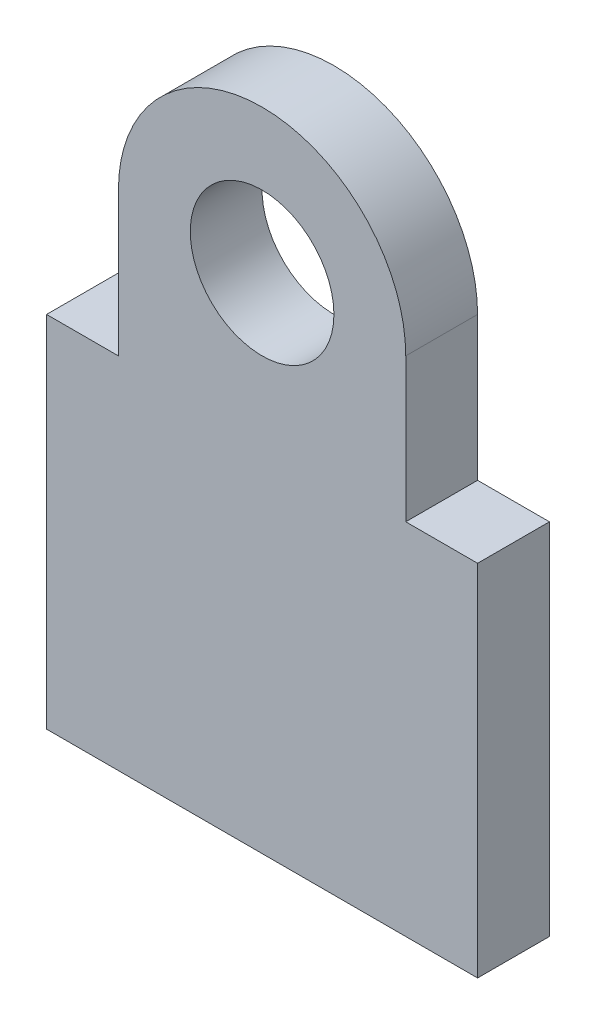
ISO-10303-21;
HEADER;
FILE_DESCRIPTION(('STEP AP214'),'2;1');
FILE_NAME('part.step','',(''),(''),'','','');
FILE_SCHEMA(('AUTOMOTIVE_DESIGN { 1 0 10303 214 1 1 1 1 }'));
ENDSEC;
DATA;
#1=APPLICATION_CONTEXT('core data for automotive mechanical design processes');
#2=APPLICATION_PROTOCOL_DEFINITION('international standard','automotive_design',2000,#1);
#3=PRODUCT_CONTEXT('',#1,'mechanical');
#4=PRODUCT('Part','Part','',(#3));
#5=PRODUCT_RELATED_PRODUCT_CATEGORY('part','',(#4));
#6=PRODUCT_DEFINITION_FORMATION('','',#4);
#7=PRODUCT_DEFINITION_CONTEXT('part definition',#1,'design');
#8=PRODUCT_DEFINITION('design','',#6,#7);
#9=PRODUCT_DEFINITION_SHAPE('','',#8);
#10=(LENGTH_UNIT() NAMED_UNIT(*) SI_UNIT(.MILLI.,.METRE.));
#11=(NAMED_UNIT(*) PLANE_ANGLE_UNIT() SI_UNIT($,.RADIAN.));
#12=(NAMED_UNIT(*) SI_UNIT($,.STERADIAN.) SOLID_ANGLE_UNIT());
#13=UNCERTAINTY_MEASURE_WITH_UNIT(LENGTH_MEASURE(1.E-05),#10,'distance_accuracy_value','');
#14=(GEOMETRIC_REPRESENTATION_CONTEXT(3) GLOBAL_UNCERTAINTY_ASSIGNED_CONTEXT((#13)) GLOBAL_UNIT_ASSIGNED_CONTEXT((#10,
#11,#12)) REPRESENTATION_CONTEXT('',''));
#15=CARTESIAN_POINT('',(0.,0.,0.));
#16=DIRECTION('',(0.,0.,1.));
#17=DIRECTION('',(1.,0.,0.));
#18=AXIS2_PLACEMENT_3D('',#15,#16,#17);
#19=CARTESIAN_POINT('',(30.,0.,10.));
#20=DIRECTION('',(-1.,0.,0.));
#21=DIRECTION('',(0.,0.,1.));
#22=AXIS2_PLACEMENT_3D('',#19,#20,#21);
#23=PLANE('',#22);
#24=DIRECTION('',(0.,1.,0.));
#25=VECTOR('',#24,1.);
#26=CARTESIAN_POINT('',(30.,0.,0.));
#27=LINE('',#26,#25);
#28=CARTESIAN_POINT('',(30.,-30.,0.));
#29=VERTEX_POINT('',#28);
#30=CARTESIAN_POINT('',(30.,20.,0.));
#31=VERTEX_POINT('',#30);
#32=EDGE_CURVE('E123',#29,#31,#27,.T.);
#33=ORIENTED_EDGE('',*,*,#32,.T.);
#34=DIRECTION('',(0.,0.,-1.));
#35=VECTOR('',#34,1.);
#36=CARTESIAN_POINT('',(30.,20.,10.));
#37=LINE('',#36,#35);
#38=CARTESIAN_POINT('',(30.,20.,10.));
#39=VERTEX_POINT('',#38);
#40=EDGE_CURVE('E11',#39,#31,#37,.T.);
#41=ORIENTED_EDGE('',*,*,#40,.F.);
#42=DIRECTION('',(0.,1.,0.));
#43=VECTOR('',#42,1.);
#44=CARTESIAN_POINT('',(30.,0.,10.));
#45=LINE('',#44,#43);
#46=CARTESIAN_POINT('',(30.,-30.,10.));
#47=VERTEX_POINT('',#46);
#48=EDGE_CURVE('E137',#47,#39,#45,.T.);
#49=ORIENTED_EDGE('',*,*,#48,.F.);
#50=DIRECTION('',(0.,0.,1.));
#51=VECTOR('',#50,1.);
#52=CARTESIAN_POINT('',(30.,-30.,0.));
#53=LINE('',#52,#51);
#54=EDGE_CURVE('E127',#29,#47,#53,.T.);
#55=ORIENTED_EDGE('',*,*,#54,.F.);
#56=EDGE_LOOP('',(#33,#41,#49,#55));
#57=FACE_BOUND('',#56,.T.);
#58=ADVANCED_FACE('F32',(#57),#23,.F.);
#59=CARTESIAN_POINT('',(30.,20.,10.));
#60=DIRECTION('',(0.,-1.,0.));
#61=DIRECTION('',(1.,0.,0.));
#62=AXIS2_PLACEMENT_3D('',#59,#60,#61);
#63=PLANE('',#62);
#64=DIRECTION('',(-1.,0.,0.));
#65=VECTOR('',#64,1.);
#66=CARTESIAN_POINT('',(30.,20.,0.));
#67=LINE('',#66,#65);
#68=CARTESIAN_POINT('',(20.,20.,0.));
#69=VERTEX_POINT('',#68);
#70=EDGE_CURVE('E126',#31,#69,#67,.T.);
#71=ORIENTED_EDGE('',*,*,#70,.T.);
#72=DIRECTION('',(0.,0.,-1.));
#73=VECTOR('',#72,1.);
#74=CARTESIAN_POINT('',(20.,20.,10.));
#75=LINE('',#74,#73);
#76=CARTESIAN_POINT('',(20.,20.,10.));
#77=VERTEX_POINT('',#76);
#78=EDGE_CURVE('E40',#77,#69,#75,.T.);
#79=ORIENTED_EDGE('',*,*,#78,.F.);
#80=DIRECTION('',(-1.,0.,0.));
#81=VECTOR('',#80,1.);
#82=CARTESIAN_POINT('',(30.,20.,10.));
#83=LINE('',#82,#81);
#84=EDGE_CURVE('E86',#39,#77,#83,.T.);
#85=ORIENTED_EDGE('',*,*,#84,.F.);
#86=ORIENTED_EDGE('',*,*,#40,.T.);
#87=EDGE_LOOP('',(#71,#79,#85,#86));
#88=FACE_BOUND('',#87,.T.);
#89=ADVANCED_FACE('F176',(#88),#63,.F.);
#90=CARTESIAN_POINT('',(20.,20.,10.));
#91=DIRECTION('',(-1.,0.,0.));
#92=DIRECTION('',(0.,0.,1.));
#93=AXIS2_PLACEMENT_3D('',#90,#91,#92);
#94=PLANE('',#93);
#95=DIRECTION('',(0.,1.,0.));
#96=VECTOR('',#95,1.);
#97=CARTESIAN_POINT('',(20.,20.,0.));
#98=LINE('',#97,#96);
#99=CARTESIAN_POINT('',(20.,40.,0.));
#100=VERTEX_POINT('',#99);
#101=EDGE_CURVE('E129',#69,#100,#98,.T.);
#102=ORIENTED_EDGE('',*,*,#101,.T.);
#103=DIRECTION('',(0.,0.,-1.));
#104=VECTOR('',#103,1.);
#105=CARTESIAN_POINT('',(20.,40.,10.));
#106=LINE('',#105,#104);
#107=CARTESIAN_POINT('',(20.,40.,10.));
#108=VERTEX_POINT('',#107);
#109=EDGE_CURVE('E112',#108,#100,#106,.T.);
#110=ORIENTED_EDGE('',*,*,#109,.F.);
#111=DIRECTION('',(0.,1.,0.));
#112=VECTOR('',#111,1.);
#113=CARTESIAN_POINT('',(20.,20.,10.));
#114=LINE('',#113,#112);
#115=EDGE_CURVE('E103',#77,#108,#114,.T.);
#116=ORIENTED_EDGE('',*,*,#115,.F.);
#117=ORIENTED_EDGE('',*,*,#78,.T.);
#118=EDGE_LOOP('',(#102,#110,#116,#117));
#119=FACE_BOUND('',#118,.T.);
#120=ADVANCED_FACE('F143',(#119),#94,.F.);
#121=CARTESIAN_POINT('',(0.,40.,10.));
#122=DIRECTION('',(0.,0.,-1.));
#123=DIRECTION('',(-1.,0.,0.));
#124=AXIS2_PLACEMENT_3D('',#121,#122,#123);
#125=CYLINDRICAL_SURFACE('',#124,20.);
#126=CARTESIAN_POINT('',(0.,40.,0.));
#127=DIRECTION('',(0.,0.,1.));
#128=DIRECTION('',(1.,0.,0.));
#129=AXIS2_PLACEMENT_3D('',#126,#127,#128);
#130=CIRCLE('',#129,20.);
#131=CARTESIAN_POINT('',(-20.,40.,0.));
#132=VERTEX_POINT('',#131);
#133=EDGE_CURVE('E111',#100,#132,#130,.T.);
#134=ORIENTED_EDGE('',*,*,#133,.T.);
#135=DIRECTION('',(0.,0.,-1.));
#136=VECTOR('',#135,1.);
#137=CARTESIAN_POINT('',(-20.,40.,10.));
#138=LINE('',#137,#136);
#139=CARTESIAN_POINT('',(-20.,40.,10.));
#140=VERTEX_POINT('',#139);
#141=EDGE_CURVE('E108',#140,#132,#138,.T.);
#142=ORIENTED_EDGE('',*,*,#141,.F.);
#143=CARTESIAN_POINT('',(0.,40.,10.));
#144=DIRECTION('',(0.,0.,1.));
#145=DIRECTION('',(1.,0.,0.));
#146=AXIS2_PLACEMENT_3D('',#143,#144,#145);
#147=CIRCLE('',#146,20.);
#148=EDGE_CURVE('E97',#108,#140,#147,.T.);
#149=ORIENTED_EDGE('',*,*,#148,.F.);
#150=ORIENTED_EDGE('',*,*,#109,.T.);
#151=EDGE_LOOP('',(#134,#142,#149,#150));
#152=FACE_BOUND('',#151,.T.);
#153=ADVANCED_FACE('F109',(#152),#125,.T.);
#154=CARTESIAN_POINT('',(-20.,20.,10.));
#155=DIRECTION('',(1.,0.,0.));
#156=DIRECTION('',(0.,1.,0.));
#157=AXIS2_PLACEMENT_3D('',#154,#155,#156);
#158=PLANE('',#157);
#159=DIRECTION('',(0.,-1.,0.));
#160=VECTOR('',#159,1.);
#161=CARTESIAN_POINT('',(-20.,20.,0.));
#162=LINE('',#161,#160);
#163=CARTESIAN_POINT('',(-20.,20.,0.));
#164=VERTEX_POINT('',#163);
#165=EDGE_CURVE('E72',#132,#164,#162,.T.);
#166=ORIENTED_EDGE('',*,*,#165,.T.);
#167=DIRECTION('',(0.,0.,-1.));
#168=VECTOR('',#167,1.);
#169=CARTESIAN_POINT('',(-20.,20.,10.));
#170=LINE('',#169,#168);
#171=CARTESIAN_POINT('',(-20.,20.,10.));
#172=VERTEX_POINT('',#171);
#173=EDGE_CURVE('E113',#172,#164,#170,.T.);
#174=ORIENTED_EDGE('',*,*,#173,.F.);
#175=DIRECTION('',(0.,-1.,0.));
#176=VECTOR('',#175,1.);
#177=CARTESIAN_POINT('',(-20.,20.,10.));
#178=LINE('',#177,#176);
#179=EDGE_CURVE('E101',#140,#172,#178,.T.);
#180=ORIENTED_EDGE('',*,*,#179,.F.);
#181=ORIENTED_EDGE('',*,*,#141,.T.);
#182=EDGE_LOOP('',(#166,#174,#180,#181));
#183=FACE_BOUND('',#182,.T.);
#184=ADVANCED_FACE('F115',(#183),#158,.F.);
#185=CARTESIAN_POINT('',(-30.,20.,10.));
#186=DIRECTION('',(0.,-1.,0.));
#187=DIRECTION('',(1.,0.,0.));
#188=AXIS2_PLACEMENT_3D('',#185,#186,#187);
#189=PLANE('',#188);
#190=DIRECTION('',(-1.,0.,0.));
#191=VECTOR('',#190,1.);
#192=CARTESIAN_POINT('',(-30.,20.,0.));
#193=LINE('',#192,#191);
#194=CARTESIAN_POINT('',(-30.,20.,0.));
#195=VERTEX_POINT('',#194);
#196=EDGE_CURVE('E78',#164,#195,#193,.T.);
#197=ORIENTED_EDGE('',*,*,#196,.T.);
#198=DIRECTION('',(0.,0.,-1.));
#199=VECTOR('',#198,1.);
#200=CARTESIAN_POINT('',(-30.,20.,10.));
#201=LINE('',#200,#199);
#202=CARTESIAN_POINT('',(-30.,20.,10.));
#203=VERTEX_POINT('',#202);
#204=EDGE_CURVE('E122',#203,#195,#201,.T.);
#205=ORIENTED_EDGE('',*,*,#204,.F.);
#206=DIRECTION('',(-1.,0.,0.));
#207=VECTOR('',#206,1.);
#208=CARTESIAN_POINT('',(-30.,20.,10.));
#209=LINE('',#208,#207);
#210=EDGE_CURVE('E48',#172,#203,#209,.T.);
#211=ORIENTED_EDGE('',*,*,#210,.F.);
#212=ORIENTED_EDGE('',*,*,#173,.T.);
#213=EDGE_LOOP('',(#197,#205,#211,#212));
#214=FACE_BOUND('',#213,.T.);
#215=ADVANCED_FACE('F188',(#214),#189,.F.);
#216=CARTESIAN_POINT('',(-30.,0.,10.));
#217=DIRECTION('',(1.,0.,0.));
#218=DIRECTION('',(0.,0.,-1.));
#219=AXIS2_PLACEMENT_3D('',#216,#217,#218);
#220=PLANE('',#219);
#221=DIRECTION('',(0.,-1.,0.));
#222=VECTOR('',#221,1.);
#223=CARTESIAN_POINT('',(-30.,0.,0.));
#224=LINE('',#223,#222);
#225=CARTESIAN_POINT('',(-30.,-30.,0.));
#226=VERTEX_POINT('',#225);
#227=EDGE_CURVE('E134',#195,#226,#224,.T.);
#228=ORIENTED_EDGE('',*,*,#227,.T.);
#229=DIRECTION('',(0.,0.,1.));
#230=VECTOR('',#229,1.);
#231=CARTESIAN_POINT('',(-30.,-30.,0.));
#232=LINE('',#231,#230);
#233=CARTESIAN_POINT('',(-30.,-30.,10.));
#234=VERTEX_POINT('',#233);
#235=EDGE_CURVE('E158',#226,#234,#232,.T.);
#236=ORIENTED_EDGE('',*,*,#235,.T.);
#237=DIRECTION('',(0.,-1.,0.));
#238=VECTOR('',#237,1.);
#239=CARTESIAN_POINT('',(-30.,0.,10.));
#240=LINE('',#239,#238);
#241=EDGE_CURVE('E117',#203,#234,#240,.T.);
#242=ORIENTED_EDGE('',*,*,#241,.F.);
#243=ORIENTED_EDGE('',*,*,#204,.T.);
#244=EDGE_LOOP('',(#228,#236,#242,#243));
#245=FACE_BOUND('',#244,.T.);
#246=ADVANCED_FACE('F155',(#245),#220,.F.);
#247=CARTESIAN_POINT('',(0.,40.,10.));
#248=DIRECTION('',(0.,0.,1.));
#249=DIRECTION('',(1.,0.,0.));
#250=AXIS2_PLACEMENT_3D('',#247,#248,#249);
#251=PLANE('',#250);
#252=CARTESIAN_POINT('',(0.,40.,10.));
#253=DIRECTION('',(0.,0.,1.));
#254=DIRECTION('',(1.,0.,0.));
#255=AXIS2_PLACEMENT_3D('',#252,#253,#254);
#256=CIRCLE('',#255,10.);
#257=CARTESIAN_POINT('',(10.,40.,10.));
#258=VERTEX_POINT('',#257);
#259=EDGE_CURVE('E209',#258,#258,#256,.T.);
#260=ORIENTED_EDGE('',*,*,#259,.F.);
#261=EDGE_LOOP('',(#260));
#262=FACE_BOUND('',#261,.T.);
#263=ORIENTED_EDGE('',*,*,#48,.T.);
#264=ORIENTED_EDGE('',*,*,#84,.T.);
#265=ORIENTED_EDGE('',*,*,#115,.T.);
#266=ORIENTED_EDGE('',*,*,#148,.T.);
#267=ORIENTED_EDGE('',*,*,#179,.T.);
#268=ORIENTED_EDGE('',*,*,#210,.T.);
#269=ORIENTED_EDGE('',*,*,#241,.T.);
#270=DIRECTION('',(1.,0.,0.));
#271=VECTOR('',#270,1.);
#272=CARTESIAN_POINT('',(-30.,-30.,10.));
#273=LINE('',#272,#271);
#274=EDGE_CURVE('E165',#234,#47,#273,.T.);
#275=ORIENTED_EDGE('',*,*,#274,.T.);
#276=EDGE_LOOP('',(#263,#264,#265,#266,#267,#268,#269,#275));
#277=FACE_BOUND('',#276,.T.);
#278=ADVANCED_FACE('F99',(#262,#277),#251,.T.);
#279=CARTESIAN_POINT('',(0.,40.,0.));
#280=DIRECTION('',(0.,0.,1.));
#281=DIRECTION('',(1.,0.,0.));
#282=AXIS2_PLACEMENT_3D('',#279,#280,#281);
#283=PLANE('',#282);
#284=CARTESIAN_POINT('',(0.,40.,0.));
#285=DIRECTION('',(0.,0.,1.));
#286=DIRECTION('',(1.,0.,0.));
#287=AXIS2_PLACEMENT_3D('',#284,#285,#286);
#288=CIRCLE('',#287,10.);
#289=CARTESIAN_POINT('',(10.,40.,0.));
#290=VERTEX_POINT('',#289);
#291=EDGE_CURVE('E212',#290,#290,#288,.T.);
#292=ORIENTED_EDGE('',*,*,#291,.T.);
#293=EDGE_LOOP('',(#292));
#294=FACE_BOUND('',#293,.T.);
#295=ORIENTED_EDGE('',*,*,#32,.F.);
#296=DIRECTION('',(1.,0.,0.));
#297=VECTOR('',#296,1.);
#298=CARTESIAN_POINT('',(-30.,-30.,0.));
#299=LINE('',#298,#297);
#300=EDGE_CURVE('E151',#226,#29,#299,.T.);
#301=ORIENTED_EDGE('',*,*,#300,.F.);
#302=ORIENTED_EDGE('',*,*,#227,.F.);
#303=ORIENTED_EDGE('',*,*,#196,.F.);
#304=ORIENTED_EDGE('',*,*,#165,.F.);
#305=ORIENTED_EDGE('',*,*,#133,.F.);
#306=ORIENTED_EDGE('',*,*,#101,.F.);
#307=ORIENTED_EDGE('',*,*,#70,.F.);
#308=EDGE_LOOP('',(#295,#301,#302,#303,#304,#305,#306,#307));
#309=FACE_BOUND('',#308,.T.);
#310=ADVANCED_FACE('F146',(#294,#309),#283,.F.);
#311=CARTESIAN_POINT('',(-30.,-30.,0.));
#312=DIRECTION('',(0.,-1.,0.));
#313=DIRECTION('',(0.,0.,-1.));
#314=AXIS2_PLACEMENT_3D('',#311,#312,#313);
#315=PLANE('',#314);
#316=ORIENTED_EDGE('',*,*,#274,.F.);
#317=ORIENTED_EDGE('',*,*,#235,.F.);
#318=ORIENTED_EDGE('',*,*,#300,.T.);
#319=ORIENTED_EDGE('',*,*,#54,.T.);
#320=EDGE_LOOP('',(#316,#317,#318,#319));
#321=FACE_BOUND('',#320,.T.);
#322=ADVANCED_FACE('F162',(#321),#315,.T.);
#323=CARTESIAN_POINT('',(0.,40.,0.));
#324=DIRECTION('',(0.,0.,1.));
#325=DIRECTION('',(1.,0.,0.));
#326=AXIS2_PLACEMENT_3D('',#323,#324,#325);
#327=CYLINDRICAL_SURFACE('',#326,10.);
#328=ORIENTED_EDGE('',*,*,#259,.T.);
#329=EDGE_LOOP('',(#328));
#330=FACE_BOUND('',#329,.T.);
#331=ORIENTED_EDGE('',*,*,#291,.F.);
#332=EDGE_LOOP('',(#331));
#333=FACE_BOUND('',#332,.T.);
#334=ADVANCED_FACE('F201',(#330,#333),#327,.F.);
#335=CLOSED_SHELL('',(#58,#89,#120,#153,#184,#215,#246,#278,#310,#322,#334));
#336=MANIFOLD_SOLID_BREP('B2',#335);
#337=ADVANCED_BREP_SHAPE_REPRESENTATION('',(#18,#336),#14);
#338=SHAPE_DEFINITION_REPRESENTATION(#9,#337);
ENDSEC;
END-ISO-10303-21;
